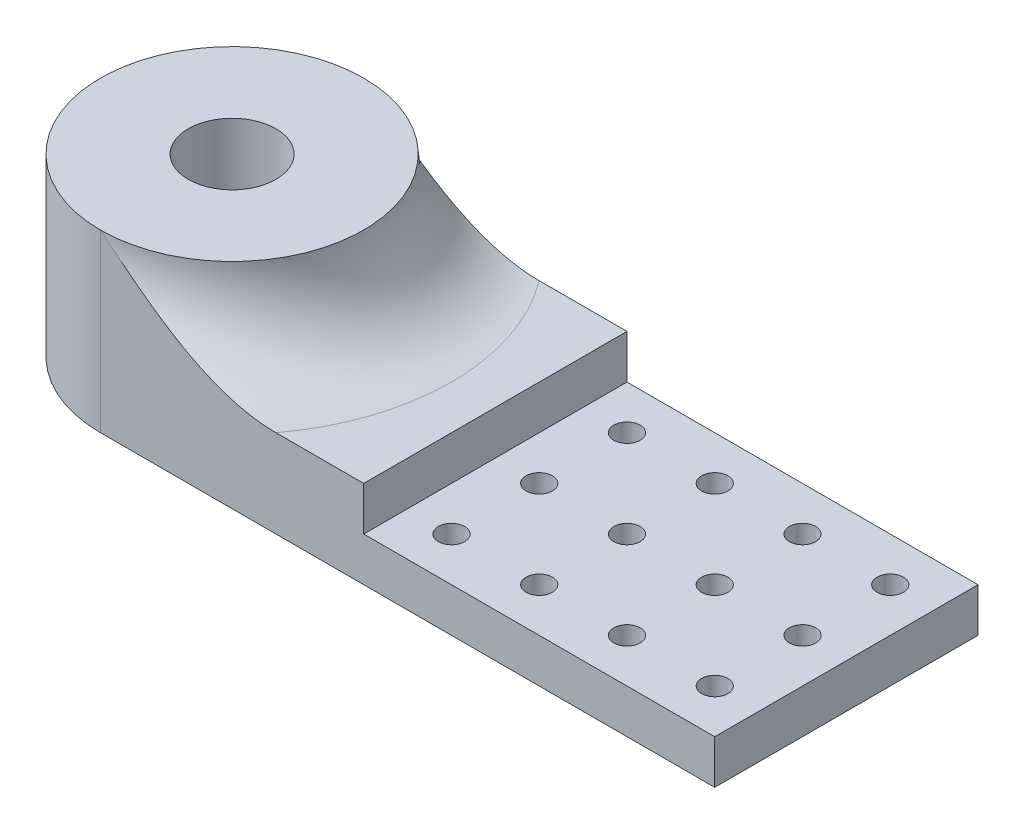
ISO-10303-21;
HEADER;
FILE_DESCRIPTION(('STEP AP214'),'2;1');
FILE_NAME('part.step','',(''),(''),'','','');
FILE_SCHEMA(('AUTOMOTIVE_DESIGN { 1 0 10303 214 1 1 1 1 }'));
ENDSEC;
DATA;
#1=APPLICATION_CONTEXT('core data for automotive mechanical design processes');
#2=APPLICATION_PROTOCOL_DEFINITION('international standard','automotive_design',2000,#1);
#3=PRODUCT_CONTEXT('',#1,'mechanical');
#4=PRODUCT('Part','Part','',(#3));
#5=PRODUCT_RELATED_PRODUCT_CATEGORY('part','',(#4));
#6=PRODUCT_DEFINITION_FORMATION('','',#4);
#7=PRODUCT_DEFINITION_CONTEXT('part definition',#1,'design');
#8=PRODUCT_DEFINITION('design','',#6,#7);
#9=PRODUCT_DEFINITION_SHAPE('','',#8);
#10=(LENGTH_UNIT() NAMED_UNIT(*) SI_UNIT(.MILLI.,.METRE.));
#11=(NAMED_UNIT(*) PLANE_ANGLE_UNIT() SI_UNIT($,.RADIAN.));
#12=(NAMED_UNIT(*) SI_UNIT($,.STERADIAN.) SOLID_ANGLE_UNIT());
#13=UNCERTAINTY_MEASURE_WITH_UNIT(LENGTH_MEASURE(1.E-05),#10,'distance_accuracy_value','');
#14=(GEOMETRIC_REPRESENTATION_CONTEXT(3) GLOBAL_UNCERTAINTY_ASSIGNED_CONTEXT((#13)) GLOBAL_UNIT_ASSIGNED_CONTEXT((#10,
#11,#12)) REPRESENTATION_CONTEXT('',''));
#15=CARTESIAN_POINT('',(0.,0.,0.));
#16=DIRECTION('',(0.,0.,1.));
#17=DIRECTION('',(1.,0.,0.));
#18=AXIS2_PLACEMENT_3D('',#15,#16,#17);
#19=CARTESIAN_POINT('',(70.,5.,-15.));
#20=DIRECTION('',(-1.,0.,0.));
#21=DIRECTION('',(0.,0.,1.));
#22=AXIS2_PLACEMENT_3D('',#19,#20,#21);
#23=PLANE('',#22);
#24=DIRECTION('',(0.,0.,-1.));
#25=VECTOR('',#24,1.);
#26=CARTESIAN_POINT('',(70.,0.,15.));
#27=LINE('',#26,#25);
#28=CARTESIAN_POINT('',(70.,0.,15.));
#29=VERTEX_POINT('',#28);
#30=CARTESIAN_POINT('',(70.,0.,-15.));
#31=VERTEX_POINT('',#30);
#32=EDGE_CURVE('E60',#29,#31,#27,.T.);
#33=ORIENTED_EDGE('',*,*,#32,.F.);
#34=DIRECTION('',(0.,-1.,0.));
#35=VECTOR('',#34,1.);
#36=CARTESIAN_POINT('',(70.,5.,15.));
#37=LINE('',#36,#35);
#38=CARTESIAN_POINT('',(70.,-5.,15.));
#39=VERTEX_POINT('',#38);
#40=EDGE_CURVE('E116',#29,#39,#37,.T.);
#41=ORIENTED_EDGE('',*,*,#40,.T.);
#42=DIRECTION('',(0.,0.,-1.));
#43=VECTOR('',#42,1.);
#44=CARTESIAN_POINT('',(70.,-5.,-15.));
#45=LINE('',#44,#43);
#46=CARTESIAN_POINT('',(70.,-5.,-15.));
#47=VERTEX_POINT('',#46);
#48=EDGE_CURVE('E189',#39,#47,#45,.T.);
#49=ORIENTED_EDGE('',*,*,#48,.T.);
#50=DIRECTION('',(0.,-1.,0.));
#51=VECTOR('',#50,1.);
#52=CARTESIAN_POINT('',(70.,5.,-15.));
#53=LINE('',#52,#51);
#54=EDGE_CURVE('E118',#31,#47,#53,.T.);
#55=ORIENTED_EDGE('',*,*,#54,.F.);
#56=EDGE_LOOP('',(#33,#41,#49,#55));
#57=FACE_BOUND('',#56,.T.);
#58=ADVANCED_FACE('F39',(#57),#23,.F.);
#59=CARTESIAN_POINT('',(0.,5.,0.));
#60=DIRECTION('',(0.,1.,0.));
#61=DIRECTION('',(0.,0.,1.));
#62=AXIS2_PLACEMENT_3D('',#59,#60,#61);
#63=PLANE('',#62);
#64=DIRECTION('',(0.,0.,1.));
#65=VECTOR('',#64,1.);
#66=CARTESIAN_POINT('',(30.,5.,-15.));
#67=LINE('',#66,#65);
#68=CARTESIAN_POINT('',(30.,5.,-15.));
#69=VERTEX_POINT('',#68);
#70=CARTESIAN_POINT('',(30.,5.,15.));
#71=VERTEX_POINT('',#70);
#72=EDGE_CURVE('E111',#69,#71,#67,.T.);
#73=ORIENTED_EDGE('',*,*,#72,.F.);
#74=DIRECTION('',(-1.,0.,0.));
#75=VECTOR('',#74,1.);
#76=CARTESIAN_POINT('',(0.,5.,-15.));
#77=LINE('',#76,#75);
#78=CARTESIAN_POINT('',(20.,5.,-15.));
#79=VERTEX_POINT('',#78);
#80=EDGE_CURVE('E68',#69,#79,#77,.T.);
#81=ORIENTED_EDGE('',*,*,#80,.T.);
#82=CARTESIAN_POINT('',(0.,5.,0.));
#83=DIRECTION('',(0.,1.,0.));
#84=DIRECTION('',(0.,0.,1.));
#85=AXIS2_PLACEMENT_3D('',#82,#83,#84);
#86=CIRCLE('',#85,25.);
#87=CARTESIAN_POINT('',(20.,5.,15.));
#88=VERTEX_POINT('',#87);
#89=EDGE_CURVE('E127',#79,#88,#86,.F.);
#90=ORIENTED_EDGE('',*,*,#89,.T.);
#91=DIRECTION('',(1.,0.,0.));
#92=VECTOR('',#91,1.);
#93=CARTESIAN_POINT('',(0.,5.,15.));
#94=LINE('',#93,#92);
#95=EDGE_CURVE('E182',#88,#71,#94,.T.);
#96=ORIENTED_EDGE('',*,*,#95,.T.);
#97=EDGE_LOOP('',(#73,#81,#90,#96));
#98=FACE_BOUND('',#97,.T.);
#99=ADVANCED_FACE('F148',(#98),#63,.T.);
#100=CARTESIAN_POINT('',(0.,-5.,0.));
#101=DIRECTION('',(0.,1.,0.));
#102=DIRECTION('',(0.,0.,1.));
#103=AXIS2_PLACEMENT_3D('',#100,#101,#102);
#104=PLANE('',#103);
#105=CARTESIAN_POINT('',(45.,-5.,-10.));
#106=DIRECTION('',(0.,1.,0.));
#107=DIRECTION('',(0.,0.,1.));
#108=AXIS2_PLACEMENT_3D('',#105,#106,#107);
#109=CIRCLE('',#108,1.5);
#110=CARTESIAN_POINT('',(45.,-5.,-8.49999999999999));
#111=VERTEX_POINT('',#110);
#112=EDGE_CURVE('E269',#111,#111,#109,.T.);
#113=ORIENTED_EDGE('',*,*,#112,.T.);
#114=EDGE_LOOP('',(#113));
#115=FACE_BOUND('',#114,.T.);
#116=CARTESIAN_POINT('',(45.,-5.,10.));
#117=DIRECTION('',(0.,1.,0.));
#118=DIRECTION('',(0.,0.,1.));
#119=AXIS2_PLACEMENT_3D('',#116,#117,#118);
#120=CIRCLE('',#119,1.5);
#121=CARTESIAN_POINT('',(45.,-5.,11.5));
#122=VERTEX_POINT('',#121);
#123=EDGE_CURVE('E270',#122,#122,#120,.T.);
#124=ORIENTED_EDGE('',*,*,#123,.T.);
#125=EDGE_LOOP('',(#124));
#126=FACE_BOUND('',#125,.T.);
#127=CARTESIAN_POINT('',(55.,-5.,-10.));
#128=DIRECTION('',(0.,1.,0.));
#129=DIRECTION('',(0.,0.,1.));
#130=AXIS2_PLACEMENT_3D('',#127,#128,#129);
#131=CIRCLE('',#130,1.5);
#132=CARTESIAN_POINT('',(55.,-5.,-8.5));
#133=VERTEX_POINT('',#132);
#134=EDGE_CURVE('E257',#133,#133,#131,.T.);
#135=ORIENTED_EDGE('',*,*,#134,.T.);
#136=EDGE_LOOP('',(#135));
#137=FACE_BOUND('',#136,.T.);
#138=CARTESIAN_POINT('',(55.,-5.,10.));
#139=DIRECTION('',(0.,1.,0.));
#140=DIRECTION('',(0.,0.,1.));
#141=AXIS2_PLACEMENT_3D('',#138,#139,#140);
#142=CIRCLE('',#141,1.5);
#143=CARTESIAN_POINT('',(55.,-5.,11.5));
#144=VERTEX_POINT('',#143);
#145=EDGE_CURVE('E258',#144,#144,#142,.T.);
#146=ORIENTED_EDGE('',*,*,#145,.T.);
#147=EDGE_LOOP('',(#146));
#148=FACE_BOUND('',#147,.T.);
#149=CARTESIAN_POINT('',(65.,-5.,-10.));
#150=DIRECTION('',(0.,1.,0.));
#151=DIRECTION('',(0.,0.,1.));
#152=AXIS2_PLACEMENT_3D('',#149,#150,#151);
#153=CIRCLE('',#152,1.5);
#154=CARTESIAN_POINT('',(65.,-5.,-8.5));
#155=VERTEX_POINT('',#154);
#156=EDGE_CURVE('E245',#155,#155,#153,.T.);
#157=ORIENTED_EDGE('',*,*,#156,.T.);
#158=EDGE_LOOP('',(#157));
#159=FACE_BOUND('',#158,.T.);
#160=CARTESIAN_POINT('',(65.,-5.,10.));
#161=DIRECTION('',(0.,1.,0.));
#162=DIRECTION('',(0.,0.,1.));
#163=AXIS2_PLACEMENT_3D('',#160,#161,#162);
#164=CIRCLE('',#163,1.5);
#165=CARTESIAN_POINT('',(65.,-5.,11.5));
#166=VERTEX_POINT('',#165);
#167=EDGE_CURVE('E246',#166,#166,#164,.T.);
#168=ORIENTED_EDGE('',*,*,#167,.T.);
#169=EDGE_LOOP('',(#168));
#170=FACE_BOUND('',#169,.T.);
#171=CARTESIAN_POINT('',(35.,-5.,-10.));
#172=DIRECTION('',(0.,1.,0.));
#173=DIRECTION('',(0.,0.,1.));
#174=AXIS2_PLACEMENT_3D('',#171,#172,#173);
#175=CIRCLE('',#174,1.5);
#176=CARTESIAN_POINT('',(35.,-5.,-8.49999999999999));
#177=VERTEX_POINT('',#176);
#178=EDGE_CURVE('E233',#177,#177,#175,.T.);
#179=ORIENTED_EDGE('',*,*,#178,.T.);
#180=EDGE_LOOP('',(#179));
#181=FACE_BOUND('',#180,.T.);
#182=CARTESIAN_POINT('',(35.,-5.,10.));
#183=DIRECTION('',(0.,1.,0.));
#184=DIRECTION('',(0.,0.,1.));
#185=AXIS2_PLACEMENT_3D('',#182,#183,#184);
#186=CIRCLE('',#185,1.5);
#187=CARTESIAN_POINT('',(35.,-5.,11.5));
#188=VERTEX_POINT('',#187);
#189=EDGE_CURVE('E234',#188,#188,#186,.T.);
#190=ORIENTED_EDGE('',*,*,#189,.T.);
#191=EDGE_LOOP('',(#190));
#192=FACE_BOUND('',#191,.T.);
#193=CARTESIAN_POINT('',(35.,-5.,0.));
#194=DIRECTION('',(0.,1.,0.));
#195=DIRECTION('',(0.,0.,1.));
#196=AXIS2_PLACEMENT_3D('',#193,#194,#195);
#197=CIRCLE('',#196,1.5);
#198=CARTESIAN_POINT('',(35.,-5.,1.50000000000001));
#199=VERTEX_POINT('',#198);
#200=EDGE_CURVE('E197',#199,#199,#197,.T.);
#201=ORIENTED_EDGE('',*,*,#200,.T.);
#202=EDGE_LOOP('',(#201));
#203=FACE_BOUND('',#202,.T.);
#204=CARTESIAN_POINT('',(45.,-5.,0.));
#205=DIRECTION('',(0.,1.,0.));
#206=DIRECTION('',(0.,0.,1.));
#207=AXIS2_PLACEMENT_3D('',#204,#205,#206);
#208=CIRCLE('',#207,1.5);
#209=CARTESIAN_POINT('',(45.,-5.,1.50000000000001));
#210=VERTEX_POINT('',#209);
#211=EDGE_CURVE('E219',#210,#210,#208,.T.);
#212=ORIENTED_EDGE('',*,*,#211,.T.);
#213=EDGE_LOOP('',(#212));
#214=FACE_BOUND('',#213,.T.);
#215=CARTESIAN_POINT('',(55.,-5.,0.));
#216=DIRECTION('',(0.,1.,0.));
#217=DIRECTION('',(0.,0.,1.));
#218=AXIS2_PLACEMENT_3D('',#215,#216,#217);
#219=CIRCLE('',#218,1.5);
#220=CARTESIAN_POINT('',(55.,-5.,1.5));
#221=VERTEX_POINT('',#220);
#222=EDGE_CURVE('E213',#221,#221,#219,.T.);
#223=ORIENTED_EDGE('',*,*,#222,.T.);
#224=EDGE_LOOP('',(#223));
#225=FACE_BOUND('',#224,.T.);
#226=CARTESIAN_POINT('',(65.,-5.,0.));
#227=DIRECTION('',(0.,1.,0.));
#228=DIRECTION('',(0.,0.,1.));
#229=AXIS2_PLACEMENT_3D('',#226,#227,#228);
#230=CIRCLE('',#229,1.5);
#231=CARTESIAN_POINT('',(65.,-5.,1.5));
#232=VERTEX_POINT('',#231);
#233=EDGE_CURVE('E206',#232,#232,#230,.T.);
#234=ORIENTED_EDGE('',*,*,#233,.T.);
#235=EDGE_LOOP('',(#234));
#236=FACE_BOUND('',#235,.T.);
#237=CARTESIAN_POINT('',(0.,-5.,0.));
#238=DIRECTION('',(0.,1.,0.));
#239=DIRECTION('',(0.,0.,1.));
#240=AXIS2_PLACEMENT_3D('',#237,#238,#239);
#241=CIRCLE('',#240,15.);
#242=CARTESIAN_POINT('',(0.,-5.,-15.));
#243=VERTEX_POINT('',#242);
#244=CARTESIAN_POINT('',(0.,-5.,15.));
#245=VERTEX_POINT('',#244);
#246=EDGE_CURVE('E177',#243,#245,#241,.T.);
#247=ORIENTED_EDGE('',*,*,#246,.F.);
#248=DIRECTION('',(-1.,0.,0.));
#249=VECTOR('',#248,1.);
#250=CARTESIAN_POINT('',(0.,-5.,-15.));
#251=LINE('',#250,#249);
#252=EDGE_CURVE('E185',#47,#243,#251,.T.);
#253=ORIENTED_EDGE('',*,*,#252,.F.);
#254=ORIENTED_EDGE('',*,*,#48,.F.);
#255=DIRECTION('',(1.,0.,0.));
#256=VECTOR('',#255,1.);
#257=CARTESIAN_POINT('',(0.,-5.,15.));
#258=LINE('',#257,#256);
#259=EDGE_CURVE('E123',#245,#39,#258,.T.);
#260=ORIENTED_EDGE('',*,*,#259,.F.);
#261=EDGE_LOOP('',(#247,#253,#254,#260));
#262=FACE_BOUND('',#261,.T.);
#263=CARTESIAN_POINT('',(0.,-5.,0.));
#264=DIRECTION('',(0.,1.,0.));
#265=DIRECTION('',(0.,0.,1.));
#266=AXIS2_PLACEMENT_3D('',#263,#264,#265);
#267=CIRCLE('',#266,5.);
#268=CARTESIAN_POINT('',(0.,-5.,5.));
#269=VERTEX_POINT('',#268);
#270=EDGE_CURVE('E175',#269,#269,#267,.T.);
#271=ORIENTED_EDGE('',*,*,#270,.T.);
#272=EDGE_LOOP('',(#271));
#273=FACE_BOUND('',#272,.T.);
#274=ADVANCED_FACE('F145',(#115,#126,#137,#148,#159,#170,#181,#192,#203,#214,#225,#236,#262,
#273),#104,.F.);
#275=CARTESIAN_POINT('',(0.,5.,0.));
#276=DIRECTION('',(0.,-1.,0.));
#277=DIRECTION('',(0.,0.,-1.));
#278=AXIS2_PLACEMENT_3D('',#275,#276,#277);
#279=CYLINDRICAL_SURFACE('',#278,15.);
#280=CARTESIAN_POINT('',(0.,15.,0.));
#281=DIRECTION('',(0.,1.,0.));
#282=DIRECTION('',(0.,0.,1.));
#283=AXIS2_PLACEMENT_3D('',#280,#281,#282);
#284=CIRCLE('',#283,15.);
#285=CARTESIAN_POINT('',(0.,15.,-15.));
#286=VERTEX_POINT('',#285);
#287=CARTESIAN_POINT('',(0.,15.,15.));
#288=VERTEX_POINT('',#287);
#289=EDGE_CURVE('E161',#286,#288,#284,.T.);
#290=ORIENTED_EDGE('',*,*,#289,.F.);
#291=DIRECTION('',(0.,-1.,0.));
#292=VECTOR('',#291,1.);
#293=CARTESIAN_POINT('',(0.,5.,-15.));
#294=LINE('',#293,#292);
#295=EDGE_CURVE('E129',#286,#243,#294,.T.);
#296=ORIENTED_EDGE('',*,*,#295,.T.);
#297=ORIENTED_EDGE('',*,*,#246,.T.);
#298=DIRECTION('',(0.,-1.,0.));
#299=VECTOR('',#298,1.);
#300=CARTESIAN_POINT('',(0.,5.,15.));
#301=LINE('',#300,#299);
#302=EDGE_CURVE('E125',#288,#245,#301,.T.);
#303=ORIENTED_EDGE('',*,*,#302,.F.);
#304=EDGE_LOOP('',(#290,#296,#297,#303));
#305=FACE_BOUND('',#304,.T.);
#306=ADVANCED_FACE('F151',(#305),#279,.T.);
#307=CARTESIAN_POINT('',(0.,5.,15.));
#308=DIRECTION('',(0.,0.,-1.));
#309=DIRECTION('',(-1.,0.,0.));
#310=AXIS2_PLACEMENT_3D('',#307,#308,#309);
#311=PLANE('',#310);
#312=DIRECTION('',(1.,0.,0.));
#313=VECTOR('',#312,1.);
#314=CARTESIAN_POINT('',(30.,0.,15.));
#315=LINE('',#314,#313);
#316=CARTESIAN_POINT('',(30.,0.,15.));
#317=VERTEX_POINT('',#316);
#318=EDGE_CURVE('E104',#317,#29,#315,.T.);
#319=ORIENTED_EDGE('',*,*,#318,.F.);
#320=DIRECTION('',(0.,1.,0.));
#321=VECTOR('',#320,1.);
#322=CARTESIAN_POINT('',(30.,0.,15.));
#323=LINE('',#322,#321);
#324=EDGE_CURVE('E201',#317,#71,#323,.T.);
#325=ORIENTED_EDGE('',*,*,#324,.T.);
#326=ORIENTED_EDGE('',*,*,#95,.F.);
#327=CARTESIAN_POINT('',(20.,5.,15.));
#328=CARTESIAN_POINT('',(19.1487940736468,5.00002224160173,15.));
#329=CARTESIAN_POINT('',(18.3004828772336,5.06945613650959,15.));
#330=CARTESIAN_POINT('',(17.0457342588435,5.26177862691041,15.));
#331=CARTESIAN_POINT('',(16.6323993737958,5.33999256192553,15.));
#332=CARTESIAN_POINT('',(15.8115541575902,5.52300913748972,15.));
#333=CARTESIAN_POINT('',(15.4040463782723,5.62782307160954,15.));
#334=CARTESIAN_POINT('',(14.3007561603173,5.94702749004248,15.));
#335=CARTESIAN_POINT('',(13.6118791698516,6.18552727470333,15.));
#336=CARTESIAN_POINT('',(12.2580609896108,6.72274896406801,15.));
#337=CARTESIAN_POINT('',(11.5931338823251,7.02150563978194,15.));
#338=CARTESIAN_POINT('',(10.2839780587996,7.66989883464341,15.));
#339=CARTESIAN_POINT('',(9.6398923190733,8.01982133687298,15.));
#340=CARTESIAN_POINT('',(8.37502639078763,8.7589216911095,15.));
#341=CARTESIAN_POINT('',(7.75424268637171,9.14809358815709,15.));
#342=CARTESIAN_POINT('',(5.89680397135544,10.3774290111662,15.));
#343=CARTESIAN_POINT('',(4.6919877836163,11.2652148457314,15.));
#344=CARTESIAN_POINT('',(2.3311357001652,13.09684634427,15.));
#345=CARTESIAN_POINT('',(1.17502359150732,14.0405984005701,14.9999999999999));
#346=CARTESIAN_POINT('',(0.0126491125807822,14.9896720443486,15.));
#347=CARTESIAN_POINT('',(0.00632455726655781,14.9948360221509,15.));
#348=CARTESIAN_POINT('',(0.,15.,15.));
#349=B_SPLINE_CURVE_WITH_KNOTS('',3,(#327,#328,#329,#330,#331,#332,#333,#334,#335,#336,#337,
#338,#339,#340,#341,#342,#343,#344,#345,#346,#347,#348),.UNSPECIFIED.,.F.,.F.,(4,2,2,2,2,2,2,2,
2,2,4),(0.,2.54640554366264,3.80743974268056,5.06901023775021,7.25228781290117,9.43682886321557,
11.6340831128601,13.831004492867,18.3156654877535,22.7930262687364,22.8175211661641),.UNSPECIFIED.);
#350=EDGE_CURVE('E11',#88,#288,#349,.T.);
#351=ORIENTED_EDGE('',*,*,#350,.T.);
#352=ORIENTED_EDGE('',*,*,#302,.T.);
#353=ORIENTED_EDGE('',*,*,#259,.T.);
#354=ORIENTED_EDGE('',*,*,#40,.F.);
#355=EDGE_LOOP('',(#319,#325,#326,#351,#352,#353,#354));
#356=FACE_BOUND('',#355,.T.);
#357=ADVANCED_FACE('F121',(#356),#311,.F.);
#358=CARTESIAN_POINT('',(0.,5.,-15.));
#359=DIRECTION('',(0.,0.,1.));
#360=DIRECTION('',(1.,0.,0.));
#361=AXIS2_PLACEMENT_3D('',#358,#359,#360);
#362=PLANE('',#361);
#363=ORIENTED_EDGE('',*,*,#80,.F.);
#364=DIRECTION('',(0.,1.,0.));
#365=VECTOR('',#364,1.);
#366=CARTESIAN_POINT('',(30.,0.,-15.));
#367=LINE('',#366,#365);
#368=CARTESIAN_POINT('',(30.,0.,-15.));
#369=VERTEX_POINT('',#368);
#370=EDGE_CURVE('E200',#369,#69,#367,.T.);
#371=ORIENTED_EDGE('',*,*,#370,.F.);
#372=DIRECTION('',(-1.,0.,0.));
#373=VECTOR('',#372,1.);
#374=CARTESIAN_POINT('',(70.,0.,-15.));
#375=LINE('',#374,#373);
#376=EDGE_CURVE('E119',#31,#369,#375,.T.);
#377=ORIENTED_EDGE('',*,*,#376,.F.);
#378=ORIENTED_EDGE('',*,*,#54,.T.);
#379=ORIENTED_EDGE('',*,*,#252,.T.);
#380=ORIENTED_EDGE('',*,*,#295,.F.);
#381=CARTESIAN_POINT('',(20.,5.,-15.));
#382=CARTESIAN_POINT('',(19.1487940736468,5.00002224160173,-15.));
#383=CARTESIAN_POINT('',(18.3004828772336,5.06945613650959,-15.));
#384=CARTESIAN_POINT('',(17.0457342588435,5.26177862691041,-15.));
#385=CARTESIAN_POINT('',(16.6323993737958,5.33999256192553,-15.));
#386=CARTESIAN_POINT('',(15.8115541575902,5.52300913748972,-15.));
#387=CARTESIAN_POINT('',(15.4040463782723,5.62782307160954,-15.));
#388=CARTESIAN_POINT('',(14.3007561603173,5.94702749004248,-15.));
#389=CARTESIAN_POINT('',(13.6118791698516,6.18552727470333,-15.));
#390=CARTESIAN_POINT('',(12.2580609896108,6.72274896406801,-15.));
#391=CARTESIAN_POINT('',(11.5931338823251,7.02150563978194,-15.));
#392=CARTESIAN_POINT('',(10.2839780587996,7.66989883464341,-15.));
#393=CARTESIAN_POINT('',(9.6398923190733,8.01982133687298,-15.));
#394=CARTESIAN_POINT('',(8.37502639078763,8.7589216911095,-15.));
#395=CARTESIAN_POINT('',(7.75424268637171,9.14809358815709,-15.));
#396=CARTESIAN_POINT('',(5.89680397135544,10.3774290111662,-15.));
#397=CARTESIAN_POINT('',(4.6919877836163,11.2652148457314,-15.));
#398=CARTESIAN_POINT('',(2.3311357001652,13.09684634427,-15.));
#399=CARTESIAN_POINT('',(1.17502359150732,14.0405984005701,-14.9999999999999));
#400=CARTESIAN_POINT('',(0.0126491125807822,14.9896720443486,-15.));
#401=CARTESIAN_POINT('',(0.00632455726655781,14.9948360221509,-15.));
#402=CARTESIAN_POINT('',(0.,15.,-15.));
#403=B_SPLINE_CURVE_WITH_KNOTS('',3,(#381,#382,#383,#384,#385,#386,#387,#388,#389,#390,#391,
#392,#393,#394,#395,#396,#397,#398,#399,#400,#401,#402),.UNSPECIFIED.,.F.,.F.,(4,2,2,2,2,2,2,2,
2,2,4),(0.,2.54640554366264,3.80743974268056,5.06901023775021,7.25228781290117,9.43682886321557,
11.6340831128601,13.831004492867,18.3156654877535,22.7930262687364,22.8175211661641),.UNSPECIFIED.);
#404=EDGE_CURVE('E53',#286,#79,#403,.F.);
#405=ORIENTED_EDGE('',*,*,#404,.T.);
#406=EDGE_LOOP('',(#363,#371,#377,#378,#379,#380,#405));
#407=FACE_BOUND('',#406,.T.);
#408=ADVANCED_FACE('F138',(#407),#362,.F.);
#409=CARTESIAN_POINT('',(0.,5.,0.));
#410=DIRECTION('',(0.,-1.,0.));
#411=DIRECTION('',(0.,0.,-1.));
#412=AXIS2_PLACEMENT_3D('',#409,#410,#411);
#413=CYLINDRICAL_SURFACE('',#412,5.);
#414=ORIENTED_EDGE('',*,*,#270,.F.);
#415=EDGE_LOOP('',(#414));
#416=FACE_BOUND('',#415,.T.);
#417=CARTESIAN_POINT('',(0.,15.,0.));
#418=DIRECTION('',(0.,1.,0.));
#419=DIRECTION('',(0.,0.,1.));
#420=AXIS2_PLACEMENT_3D('',#417,#418,#419);
#421=CIRCLE('',#420,5.);
#422=CARTESIAN_POINT('',(0.,15.,5.));
#423=VERTEX_POINT('',#422);
#424=EDGE_CURVE('E168',#423,#423,#421,.T.);
#425=ORIENTED_EDGE('',*,*,#424,.T.);
#426=EDGE_LOOP('',(#425));
#427=FACE_BOUND('',#426,.T.);
#428=ADVANCED_FACE('F143',(#416,#427),#413,.F.);
#429=CARTESIAN_POINT('',(0.,15.,0.));
#430=DIRECTION('',(0.,1.,0.));
#431=DIRECTION('',(0.,0.,1.));
#432=AXIS2_PLACEMENT_3D('',#429,#430,#431);
#433=PLANE('',#432);
#434=EDGE_CURVE('E167',#288,#286,#284,.T.);
#435=ORIENTED_EDGE('',*,*,#434,.T.);
#436=ORIENTED_EDGE('',*,*,#289,.T.);
#437=EDGE_LOOP('',(#435,#436));
#438=FACE_BOUND('',#437,.T.);
#439=ORIENTED_EDGE('',*,*,#424,.F.);
#440=EDGE_LOOP('',(#439));
#441=FACE_BOUND('',#440,.T.);
#442=ADVANCED_FACE('F170',(#438,#441),#433,.T.);
#443=CARTESIAN_POINT('',(0.,15.,0.));
#444=DIRECTION('',(0.,1.,0.));
#445=DIRECTION('',(0.,0.,1.));
#446=AXIS2_PLACEMENT_3D('',#443,#444,#445);
#447=TOROIDAL_SURFACE('',#446,25.,10.);
#448=ORIENTED_EDGE('',*,*,#350,.F.);
#449=ORIENTED_EDGE('',*,*,#89,.F.);
#450=ORIENTED_EDGE('',*,*,#404,.F.);
#451=ORIENTED_EDGE('',*,*,#434,.F.);
#452=EDGE_LOOP('',(#448,#449,#450,#451));
#453=FACE_BOUND('',#452,.T.);
#454=ADVANCED_FACE('F41',(#453),#447,.F.);
#455=CARTESIAN_POINT('',(30.,0.,-15.));
#456=DIRECTION('',(-1.,0.,0.));
#457=DIRECTION('',(0.,0.,1.));
#458=AXIS2_PLACEMENT_3D('',#455,#456,#457);
#459=PLANE('',#458);
#460=ORIENTED_EDGE('',*,*,#72,.T.);
#461=ORIENTED_EDGE('',*,*,#324,.F.);
#462=DIRECTION('',(0.,0.,1.));
#463=VECTOR('',#462,1.);
#464=CARTESIAN_POINT('',(30.,0.,-15.));
#465=LINE('',#464,#463);
#466=EDGE_CURVE('E107',#369,#317,#465,.T.);
#467=ORIENTED_EDGE('',*,*,#466,.F.);
#468=ORIENTED_EDGE('',*,*,#370,.T.);
#469=EDGE_LOOP('',(#460,#461,#467,#468));
#470=FACE_BOUND('',#469,.T.);
#471=ADVANCED_FACE('F289',(#470),#459,.F.);
#472=CARTESIAN_POINT('',(0.,0.,0.));
#473=DIRECTION('',(0.,1.,0.));
#474=DIRECTION('',(0.,0.,1.));
#475=AXIS2_PLACEMENT_3D('',#472,#473,#474);
#476=PLANE('',#475);
#477=CARTESIAN_POINT('',(45.,0.,-10.));
#478=DIRECTION('',(0.,1.,0.));
#479=DIRECTION('',(0.,0.,1.));
#480=AXIS2_PLACEMENT_3D('',#477,#478,#479);
#481=CIRCLE('',#480,1.5);
#482=CARTESIAN_POINT('',(45.,0.,-8.49999999999999));
#483=VERTEX_POINT('',#482);
#484=EDGE_CURVE('E261',#483,#483,#481,.T.);
#485=ORIENTED_EDGE('',*,*,#484,.F.);
#486=EDGE_LOOP('',(#485));
#487=FACE_BOUND('',#486,.T.);
#488=CARTESIAN_POINT('',(45.,0.,10.));
#489=DIRECTION('',(0.,1.,0.));
#490=DIRECTION('',(0.,0.,1.));
#491=AXIS2_PLACEMENT_3D('',#488,#489,#490);
#492=CIRCLE('',#491,1.5);
#493=CARTESIAN_POINT('',(45.,0.,11.5));
#494=VERTEX_POINT('',#493);
#495=EDGE_CURVE('E266',#494,#494,#492,.T.);
#496=ORIENTED_EDGE('',*,*,#495,.F.);
#497=EDGE_LOOP('',(#496));
#498=FACE_BOUND('',#497,.T.);
#499=CARTESIAN_POINT('',(55.,0.,-10.));
#500=DIRECTION('',(0.,1.,0.));
#501=DIRECTION('',(0.,0.,1.));
#502=AXIS2_PLACEMENT_3D('',#499,#500,#501);
#503=CIRCLE('',#502,1.5);
#504=CARTESIAN_POINT('',(55.,0.,-8.5));
#505=VERTEX_POINT('',#504);
#506=EDGE_CURVE('E249',#505,#505,#503,.T.);
#507=ORIENTED_EDGE('',*,*,#506,.F.);
#508=EDGE_LOOP('',(#507));
#509=FACE_BOUND('',#508,.T.);
#510=CARTESIAN_POINT('',(55.,0.,10.));
#511=DIRECTION('',(0.,1.,0.));
#512=DIRECTION('',(0.,0.,1.));
#513=AXIS2_PLACEMENT_3D('',#510,#511,#512);
#514=CIRCLE('',#513,1.5);
#515=CARTESIAN_POINT('',(55.,0.,11.5));
#516=VERTEX_POINT('',#515);
#517=EDGE_CURVE('E254',#516,#516,#514,.T.);
#518=ORIENTED_EDGE('',*,*,#517,.F.);
#519=EDGE_LOOP('',(#518));
#520=FACE_BOUND('',#519,.T.);
#521=CARTESIAN_POINT('',(65.,0.,-10.));
#522=DIRECTION('',(0.,1.,0.));
#523=DIRECTION('',(0.,0.,1.));
#524=AXIS2_PLACEMENT_3D('',#521,#522,#523);
#525=CIRCLE('',#524,1.5);
#526=CARTESIAN_POINT('',(65.,0.,-8.5));
#527=VERTEX_POINT('',#526);
#528=EDGE_CURVE('E237',#527,#527,#525,.T.);
#529=ORIENTED_EDGE('',*,*,#528,.F.);
#530=EDGE_LOOP('',(#529));
#531=FACE_BOUND('',#530,.T.);
#532=CARTESIAN_POINT('',(65.,0.,10.));
#533=DIRECTION('',(0.,1.,0.));
#534=DIRECTION('',(0.,0.,1.));
#535=AXIS2_PLACEMENT_3D('',#532,#533,#534);
#536=CIRCLE('',#535,1.5);
#537=CARTESIAN_POINT('',(65.,0.,11.5));
#538=VERTEX_POINT('',#537);
#539=EDGE_CURVE('E242',#538,#538,#536,.T.);
#540=ORIENTED_EDGE('',*,*,#539,.F.);
#541=EDGE_LOOP('',(#540));
#542=FACE_BOUND('',#541,.T.);
#543=CARTESIAN_POINT('',(35.,0.,-10.));
#544=DIRECTION('',(0.,1.,0.));
#545=DIRECTION('',(0.,0.,1.));
#546=AXIS2_PLACEMENT_3D('',#543,#544,#545);
#547=CIRCLE('',#546,1.5);
#548=CARTESIAN_POINT('',(35.,0.,-8.49999999999999));
#549=VERTEX_POINT('',#548);
#550=EDGE_CURVE('E210',#549,#549,#547,.T.);
#551=ORIENTED_EDGE('',*,*,#550,.F.);
#552=EDGE_LOOP('',(#551));
#553=FACE_BOUND('',#552,.T.);
#554=CARTESIAN_POINT('',(35.,0.,10.));
#555=DIRECTION('',(0.,1.,0.));
#556=DIRECTION('',(0.,0.,1.));
#557=AXIS2_PLACEMENT_3D('',#554,#555,#556);
#558=CIRCLE('',#557,1.5);
#559=CARTESIAN_POINT('',(35.,0.,11.5));
#560=VERTEX_POINT('',#559);
#561=EDGE_CURVE('E230',#560,#560,#558,.T.);
#562=ORIENTED_EDGE('',*,*,#561,.F.);
#563=EDGE_LOOP('',(#562));
#564=FACE_BOUND('',#563,.T.);
#565=CARTESIAN_POINT('',(35.,0.,0.));
#566=DIRECTION('',(0.,1.,0.));
#567=DIRECTION('',(0.,0.,1.));
#568=AXIS2_PLACEMENT_3D('',#565,#566,#567);
#569=CIRCLE('',#568,1.5);
#570=CARTESIAN_POINT('',(35.,0.,1.50000000000001));
#571=VERTEX_POINT('',#570);
#572=EDGE_CURVE('E225',#571,#571,#569,.T.);
#573=ORIENTED_EDGE('',*,*,#572,.F.);
#574=EDGE_LOOP('',(#573));
#575=FACE_BOUND('',#574,.T.);
#576=CARTESIAN_POINT('',(45.,0.,0.));
#577=DIRECTION('',(0.,1.,0.));
#578=DIRECTION('',(0.,0.,1.));
#579=AXIS2_PLACEMENT_3D('',#576,#577,#578);
#580=CIRCLE('',#579,1.5);
#581=CARTESIAN_POINT('',(45.,0.,1.50000000000001));
#582=VERTEX_POINT('',#581);
#583=EDGE_CURVE('E222',#582,#582,#580,.T.);
#584=ORIENTED_EDGE('',*,*,#583,.F.);
#585=EDGE_LOOP('',(#584));
#586=FACE_BOUND('',#585,.T.);
#587=CARTESIAN_POINT('',(55.,0.,0.));
#588=DIRECTION('',(0.,1.,0.));
#589=DIRECTION('',(0.,0.,1.));
#590=AXIS2_PLACEMENT_3D('',#587,#588,#589);
#591=CIRCLE('',#590,1.5);
#592=CARTESIAN_POINT('',(55.,0.,1.5));
#593=VERTEX_POINT('',#592);
#594=EDGE_CURVE('E216',#593,#593,#591,.T.);
#595=ORIENTED_EDGE('',*,*,#594,.F.);
#596=EDGE_LOOP('',(#595));
#597=FACE_BOUND('',#596,.T.);
#598=CARTESIAN_POINT('',(65.,0.,0.));
#599=DIRECTION('',(0.,1.,0.));
#600=DIRECTION('',(0.,0.,1.));
#601=AXIS2_PLACEMENT_3D('',#598,#599,#600);
#602=CIRCLE('',#601,1.5);
#603=CARTESIAN_POINT('',(65.,0.,1.5));
#604=VERTEX_POINT('',#603);
#605=EDGE_CURVE('E209',#604,#604,#602,.T.);
#606=ORIENTED_EDGE('',*,*,#605,.F.);
#607=EDGE_LOOP('',(#606));
#608=FACE_BOUND('',#607,.T.);
#609=ORIENTED_EDGE('',*,*,#318,.T.);
#610=ORIENTED_EDGE('',*,*,#32,.T.);
#611=ORIENTED_EDGE('',*,*,#376,.T.);
#612=ORIENTED_EDGE('',*,*,#466,.T.);
#613=EDGE_LOOP('',(#609,#610,#611,#612));
#614=FACE_BOUND('',#613,.T.);
#615=ADVANCED_FACE('F105',(#487,#498,#509,#520,#531,#542,#553,#564,#575,#586,#597,#608,#614),
#476,.T.);
#616=CARTESIAN_POINT('',(65.,-5.,0.));
#617=DIRECTION('',(0.,1.,0.));
#618=DIRECTION('',(0.,0.,1.));
#619=AXIS2_PLACEMENT_3D('',#616,#617,#618);
#620=CYLINDRICAL_SURFACE('',#619,1.5);
#621=ORIENTED_EDGE('',*,*,#233,.F.);
#622=EDGE_LOOP('',(#621));
#623=FACE_BOUND('',#622,.T.);
#624=ORIENTED_EDGE('',*,*,#605,.T.);
#625=EDGE_LOOP('',(#624));
#626=FACE_BOUND('',#625,.T.);
#627=ADVANCED_FACE('F288',(#623,#626),#620,.F.);
#628=CARTESIAN_POINT('',(55.,-5.,0.));
#629=DIRECTION('',(0.,1.,0.));
#630=DIRECTION('',(0.,0.,1.));
#631=AXIS2_PLACEMENT_3D('',#628,#629,#630);
#632=CYLINDRICAL_SURFACE('',#631,1.5);
#633=ORIENTED_EDGE('',*,*,#222,.F.);
#634=EDGE_LOOP('',(#633));
#635=FACE_BOUND('',#634,.T.);
#636=ORIENTED_EDGE('',*,*,#594,.T.);
#637=EDGE_LOOP('',(#636));
#638=FACE_BOUND('',#637,.T.);
#639=ADVANCED_FACE('F314',(#635,#638),#632,.F.);
#640=CARTESIAN_POINT('',(45.,-5.,0.));
#641=DIRECTION('',(0.,1.,0.));
#642=DIRECTION('',(0.,0.,1.));
#643=AXIS2_PLACEMENT_3D('',#640,#641,#642);
#644=CYLINDRICAL_SURFACE('',#643,1.5);
#645=ORIENTED_EDGE('',*,*,#211,.F.);
#646=EDGE_LOOP('',(#645));
#647=FACE_BOUND('',#646,.T.);
#648=ORIENTED_EDGE('',*,*,#583,.T.);
#649=EDGE_LOOP('',(#648));
#650=FACE_BOUND('',#649,.T.);
#651=ADVANCED_FACE('F320',(#647,#650),#644,.F.);
#652=CARTESIAN_POINT('',(35.,-5.,0.));
#653=DIRECTION('',(0.,1.,0.));
#654=DIRECTION('',(0.,0.,1.));
#655=AXIS2_PLACEMENT_3D('',#652,#653,#654);
#656=CYLINDRICAL_SURFACE('',#655,1.5);
#657=ORIENTED_EDGE('',*,*,#200,.F.);
#658=EDGE_LOOP('',(#657));
#659=FACE_BOUND('',#658,.T.);
#660=ORIENTED_EDGE('',*,*,#572,.T.);
#661=EDGE_LOOP('',(#660));
#662=FACE_BOUND('',#661,.T.);
#663=ADVANCED_FACE('F349',(#659,#662),#656,.F.);
#664=CARTESIAN_POINT('',(35.,-5.,10.));
#665=DIRECTION('',(0.,1.,0.));
#666=DIRECTION('',(0.,0.,1.));
#667=AXIS2_PLACEMENT_3D('',#664,#665,#666);
#668=CYLINDRICAL_SURFACE('',#667,1.5);
#669=ORIENTED_EDGE('',*,*,#189,.F.);
#670=EDGE_LOOP('',(#669));
#671=FACE_BOUND('',#670,.T.);
#672=ORIENTED_EDGE('',*,*,#561,.T.);
#673=EDGE_LOOP('',(#672));
#674=FACE_BOUND('',#673,.T.);
#675=ADVANCED_FACE('F362',(#671,#674),#668,.F.);
#676=CARTESIAN_POINT('',(35.,-5.,-10.));
#677=DIRECTION('',(0.,1.,0.));
#678=DIRECTION('',(0.,0.,1.));
#679=AXIS2_PLACEMENT_3D('',#676,#677,#678);
#680=CYLINDRICAL_SURFACE('',#679,1.5);
#681=ORIENTED_EDGE('',*,*,#178,.F.);
#682=EDGE_LOOP('',(#681));
#683=FACE_BOUND('',#682,.T.);
#684=ORIENTED_EDGE('',*,*,#550,.T.);
#685=EDGE_LOOP('',(#684));
#686=FACE_BOUND('',#685,.T.);
#687=ADVANCED_FACE('F367',(#683,#686),#680,.F.);
#688=CARTESIAN_POINT('',(65.,-5.,10.));
#689=DIRECTION('',(0.,1.,0.));
#690=DIRECTION('',(0.,0.,1.));
#691=AXIS2_PLACEMENT_3D('',#688,#689,#690);
#692=CYLINDRICAL_SURFACE('',#691,1.5);
#693=ORIENTED_EDGE('',*,*,#167,.F.);
#694=EDGE_LOOP('',(#693));
#695=FACE_BOUND('',#694,.T.);
#696=ORIENTED_EDGE('',*,*,#539,.T.);
#697=EDGE_LOOP('',(#696));
#698=FACE_BOUND('',#697,.T.);
#699=ADVANCED_FACE('F377',(#695,#698),#692,.F.);
#700=CARTESIAN_POINT('',(65.,-5.,-10.));
#701=DIRECTION('',(0.,1.,0.));
#702=DIRECTION('',(0.,0.,1.));
#703=AXIS2_PLACEMENT_3D('',#700,#701,#702);
#704=CYLINDRICAL_SURFACE('',#703,1.5);
#705=ORIENTED_EDGE('',*,*,#156,.F.);
#706=EDGE_LOOP('',(#705));
#707=FACE_BOUND('',#706,.T.);
#708=ORIENTED_EDGE('',*,*,#528,.T.);
#709=EDGE_LOOP('',(#708));
#710=FACE_BOUND('',#709,.T.);
#711=ADVANCED_FACE('F387',(#707,#710),#704,.F.);
#712=CARTESIAN_POINT('',(55.,-5.,10.));
#713=DIRECTION('',(0.,1.,0.));
#714=DIRECTION('',(0.,0.,1.));
#715=AXIS2_PLACEMENT_3D('',#712,#713,#714);
#716=CYLINDRICAL_SURFACE('',#715,1.5);
#717=ORIENTED_EDGE('',*,*,#145,.F.);
#718=EDGE_LOOP('',(#717));
#719=FACE_BOUND('',#718,.T.);
#720=ORIENTED_EDGE('',*,*,#517,.T.);
#721=EDGE_LOOP('',(#720));
#722=FACE_BOUND('',#721,.T.);
#723=ADVANCED_FACE('F397',(#719,#722),#716,.F.);
#724=CARTESIAN_POINT('',(55.,-5.,-10.));
#725=DIRECTION('',(0.,1.,0.));
#726=DIRECTION('',(0.,0.,1.));
#727=AXIS2_PLACEMENT_3D('',#724,#725,#726);
#728=CYLINDRICAL_SURFACE('',#727,1.5);
#729=ORIENTED_EDGE('',*,*,#134,.F.);
#730=EDGE_LOOP('',(#729));
#731=FACE_BOUND('',#730,.T.);
#732=ORIENTED_EDGE('',*,*,#506,.T.);
#733=EDGE_LOOP('',(#732));
#734=FACE_BOUND('',#733,.T.);
#735=ADVANCED_FACE('F407',(#731,#734),#728,.F.);
#736=CARTESIAN_POINT('',(45.,-5.,10.));
#737=DIRECTION('',(0.,1.,0.));
#738=DIRECTION('',(0.,0.,1.));
#739=AXIS2_PLACEMENT_3D('',#736,#737,#738);
#740=CYLINDRICAL_SURFACE('',#739,1.5);
#741=ORIENTED_EDGE('',*,*,#123,.F.);
#742=EDGE_LOOP('',(#741));
#743=FACE_BOUND('',#742,.T.);
#744=ORIENTED_EDGE('',*,*,#495,.T.);
#745=EDGE_LOOP('',(#744));
#746=FACE_BOUND('',#745,.T.);
#747=ADVANCED_FACE('F282',(#743,#746),#740,.F.);
#748=CARTESIAN_POINT('',(45.,-5.,-10.));
#749=DIRECTION('',(0.,1.,0.));
#750=DIRECTION('',(0.,0.,1.));
#751=AXIS2_PLACEMENT_3D('',#748,#749,#750);
#752=CYLINDRICAL_SURFACE('',#751,1.5);
#753=ORIENTED_EDGE('',*,*,#112,.F.);
#754=EDGE_LOOP('',(#753));
#755=FACE_BOUND('',#754,.T.);
#756=ORIENTED_EDGE('',*,*,#484,.T.);
#757=EDGE_LOOP('',(#756));
#758=FACE_BOUND('',#757,.T.);
#759=ADVANCED_FACE('F279',(#755,#758),#752,.F.);
#760=CLOSED_SHELL('',(#58,#99,#274,#306,#357,#408,#428,#442,#454,#471,#615,#627,#639,#651,#663,
#675,#687,#699,#711,#723,#735,#747,#759));
#761=MANIFOLD_SOLID_BREP('B2',#760);
#762=ADVANCED_BREP_SHAPE_REPRESENTATION('',(#18,#761),#14);
#763=SHAPE_DEFINITION_REPRESENTATION(#9,#762);
ENDSEC;
END-ISO-10303-21;
